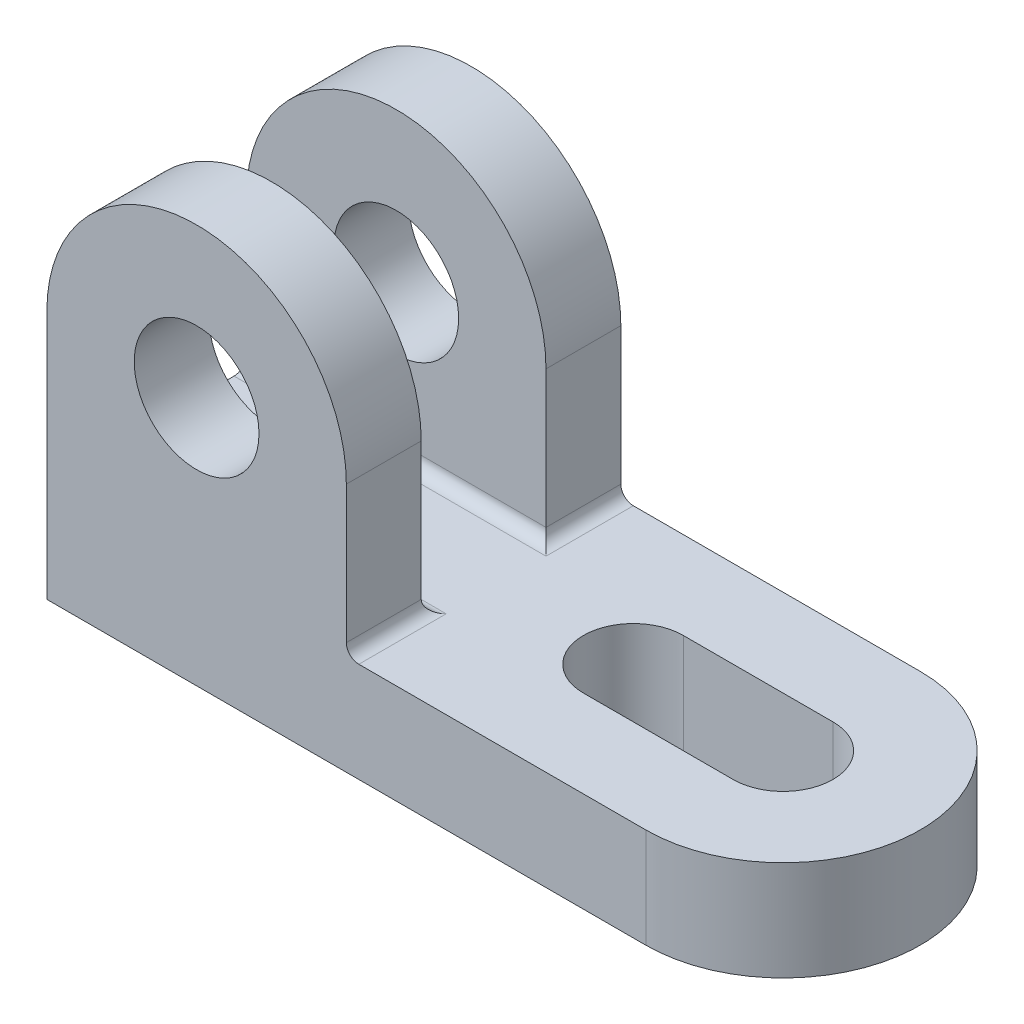
ISO-10303-21;
HEADER;
FILE_DESCRIPTION(('STEP AP214'),'2;1');
FILE_NAME('part.step','',(''),(''),'','','');
FILE_SCHEMA(('AUTOMOTIVE_DESIGN { 1 0 10303 214 1 1 1 1 }'));
ENDSEC;
DATA;
#1=APPLICATION_CONTEXT('core data for automotive mechanical design processes');
#2=APPLICATION_PROTOCOL_DEFINITION('international standard','automotive_design',2000,#1);
#3=PRODUCT_CONTEXT('',#1,'mechanical');
#4=PRODUCT('Part','Part','',(#3));
#5=PRODUCT_RELATED_PRODUCT_CATEGORY('part','',(#4));
#6=PRODUCT_DEFINITION_FORMATION('','',#4);
#7=PRODUCT_DEFINITION_CONTEXT('part definition',#1,'design');
#8=PRODUCT_DEFINITION('design','',#6,#7);
#9=PRODUCT_DEFINITION_SHAPE('','',#8);
#10=(LENGTH_UNIT() NAMED_UNIT(*) SI_UNIT(.MILLI.,.METRE.));
#11=(NAMED_UNIT(*) PLANE_ANGLE_UNIT() SI_UNIT($,.RADIAN.));
#12=(NAMED_UNIT(*) SI_UNIT($,.STERADIAN.) SOLID_ANGLE_UNIT());
#13=UNCERTAINTY_MEASURE_WITH_UNIT(LENGTH_MEASURE(1.E-05),#10,'distance_accuracy_value','');
#14=(GEOMETRIC_REPRESENTATION_CONTEXT(3) GLOBAL_UNCERTAINTY_ASSIGNED_CONTEXT((#13)) GLOBAL_UNIT_ASSIGNED_CONTEXT((#10,
#11,#12)) REPRESENTATION_CONTEXT('',''));
#15=CARTESIAN_POINT('',(0.,0.,0.));
#16=DIRECTION('',(0.,0.,1.));
#17=DIRECTION('',(1.,0.,0.));
#18=AXIS2_PLACEMENT_3D('',#15,#16,#17);
#19=CARTESIAN_POINT('',(0.,16.,22.));
#20=DIRECTION('',(0.,0.,-1.));
#21=DIRECTION('',(-1.,0.,0.));
#22=AXIS2_PLACEMENT_3D('',#19,#20,#21);
#23=PLANE('',#22);
#24=DIRECTION('',(1.,0.,0.));
#25=VECTOR('',#24,1.);
#26=CARTESIAN_POINT('',(0.,0.,22.));
#27=LINE('',#26,#25);
#28=CARTESIAN_POINT('',(-59.,0.,22.));
#29=VERTEX_POINT('',#28);
#30=CARTESIAN_POINT('',(37.,0.,22.));
#31=VERTEX_POINT('',#30);
#32=EDGE_CURVE('E227',#29,#31,#27,.T.);
#33=ORIENTED_EDGE('',*,*,#32,.T.);
#34=DIRECTION('',(0.,-1.,0.));
#35=VECTOR('',#34,1.);
#36=CARTESIAN_POINT('',(37.,16.,22.));
#37=LINE('',#36,#35);
#38=CARTESIAN_POINT('',(37.,16.,22.));
#39=VERTEX_POINT('',#38);
#40=EDGE_CURVE('E262',#39,#31,#37,.T.);
#41=ORIENTED_EDGE('',*,*,#40,.F.);
#42=DIRECTION('',(1.,0.,0.));
#43=VECTOR('',#42,1.);
#44=CARTESIAN_POINT('',(0.,16.,22.));
#45=LINE('',#44,#43);
#46=CARTESIAN_POINT('',(-9.,16.,22.));
#47=VERTEX_POINT('',#46);
#48=EDGE_CURVE('E240',#47,#39,#45,.T.);
#49=ORIENTED_EDGE('',*,*,#48,.F.);
#50=CARTESIAN_POINT('',(-9.,18.,22.));
#51=DIRECTION('',(0.,0.,-1.));
#52=DIRECTION('',(-1.,0.,0.));
#53=AXIS2_PLACEMENT_3D('',#50,#51,#52);
#54=CIRCLE('',#53,2.);
#55=CARTESIAN_POINT('',(-11.,18.,22.));
#56=VERTEX_POINT('',#55);
#57=EDGE_CURVE('E289',#47,#56,#54,.T.);
#58=ORIENTED_EDGE('',*,*,#57,.T.);
#59=DIRECTION('',(0.,1.,0.));
#60=VECTOR('',#59,1.);
#61=CARTESIAN_POINT('',(-11.,0.,22.));
#62=LINE('',#61,#60);
#63=CARTESIAN_POINT('',(-11.,40.,22.));
#64=VERTEX_POINT('',#63);
#65=EDGE_CURVE('E192',#56,#64,#62,.T.);
#66=ORIENTED_EDGE('',*,*,#65,.T.);
#67=CARTESIAN_POINT('',(-35.,40.,22.));
#68=DIRECTION('',(0.,0.,1.));
#69=DIRECTION('',(1.,0.,0.));
#70=AXIS2_PLACEMENT_3D('',#67,#68,#69);
#71=CIRCLE('',#70,24.);
#72=CARTESIAN_POINT('',(-59.,40.,22.));
#73=VERTEX_POINT('',#72);
#74=EDGE_CURVE('E183',#64,#73,#71,.T.);
#75=ORIENTED_EDGE('',*,*,#74,.T.);
#76=DIRECTION('',(0.,-1.,0.));
#77=VECTOR('',#76,1.);
#78=CARTESIAN_POINT('',(-59.,16.,22.));
#79=LINE('',#78,#77);
#80=EDGE_CURVE('E250',#73,#29,#79,.T.);
#81=ORIENTED_EDGE('',*,*,#80,.T.);
#82=EDGE_LOOP('',(#33,#41,#49,#58,#66,#75,#81));
#83=FACE_BOUND('',#82,.T.);
#84=CARTESIAN_POINT('',(-35.,40.,22.));
#85=DIRECTION('',(0.,0.,1.));
#86=DIRECTION('',(1.,0.,0.));
#87=AXIS2_PLACEMENT_3D('',#84,#85,#86);
#88=CIRCLE('',#87,10.);
#89=CARTESIAN_POINT('',(-25.,40.,22.));
#90=VERTEX_POINT('',#89);
#91=EDGE_CURVE('E176',#90,#90,#88,.T.);
#92=ORIENTED_EDGE('',*,*,#91,.F.);
#93=EDGE_LOOP('',(#92));
#94=FACE_BOUND('',#93,.T.);
#95=ADVANCED_FACE('F39',(#83,#94),#23,.F.);
#96=CARTESIAN_POINT('',(37.,16.,0.));
#97=DIRECTION('',(0.,-1.,0.));
#98=DIRECTION('',(0.,0.,-1.));
#99=AXIS2_PLACEMENT_3D('',#96,#97,#98);
#100=CYLINDRICAL_SURFACE('',#99,22.);
#101=CARTESIAN_POINT('',(37.,0.,0.));
#102=DIRECTION('',(0.,1.,0.));
#103=DIRECTION('',(0.,0.,1.));
#104=AXIS2_PLACEMENT_3D('',#101,#102,#103);
#105=CIRCLE('',#104,22.);
#106=CARTESIAN_POINT('',(37.,0.,-22.));
#107=VERTEX_POINT('',#106);
#108=EDGE_CURVE('E253',#31,#107,#105,.T.);
#109=ORIENTED_EDGE('',*,*,#108,.T.);
#110=DIRECTION('',(0.,-1.,0.));
#111=VECTOR('',#110,1.);
#112=CARTESIAN_POINT('',(37.,16.,-22.));
#113=LINE('',#112,#111);
#114=CARTESIAN_POINT('',(37.,16.,-22.));
#115=VERTEX_POINT('',#114);
#116=EDGE_CURVE('E265',#115,#107,#113,.T.);
#117=ORIENTED_EDGE('',*,*,#116,.F.);
#118=CARTESIAN_POINT('',(37.,16.,0.));
#119=DIRECTION('',(0.,1.,0.));
#120=DIRECTION('',(0.,0.,1.));
#121=AXIS2_PLACEMENT_3D('',#118,#119,#120);
#122=CIRCLE('',#121,22.);
#123=EDGE_CURVE('E239',#39,#115,#122,.T.);
#124=ORIENTED_EDGE('',*,*,#123,.F.);
#125=ORIENTED_EDGE('',*,*,#40,.T.);
#126=EDGE_LOOP('',(#109,#117,#124,#125));
#127=FACE_BOUND('',#126,.T.);
#128=ADVANCED_FACE('F335',(#127),#100,.T.);
#129=CARTESIAN_POINT('',(0.,16.,-22.));
#130=DIRECTION('',(0.,0.,-1.));
#131=DIRECTION('',(-1.,0.,0.));
#132=AXIS2_PLACEMENT_3D('',#129,#130,#131);
#133=PLANE('',#132);
#134=DIRECTION('',(1.,0.,0.));
#135=VECTOR('',#134,1.);
#136=CARTESIAN_POINT('',(0.,0.,-22.));
#137=LINE('',#136,#135);
#138=CARTESIAN_POINT('',(-59.,0.,-22.));
#139=VERTEX_POINT('',#138);
#140=EDGE_CURVE('E255',#139,#107,#137,.T.);
#141=ORIENTED_EDGE('',*,*,#140,.F.);
#142=DIRECTION('',(0.,-1.,0.));
#143=VECTOR('',#142,1.);
#144=CARTESIAN_POINT('',(-59.,16.,-22.));
#145=LINE('',#144,#143);
#146=CARTESIAN_POINT('',(-59.,40.,-22.));
#147=VERTEX_POINT('',#146);
#148=EDGE_CURVE('E257',#147,#139,#145,.T.);
#149=ORIENTED_EDGE('',*,*,#148,.F.);
#150=CARTESIAN_POINT('',(-35.,40.,-22.));
#151=DIRECTION('',(0.,0.,1.));
#152=DIRECTION('',(1.,0.,0.));
#153=AXIS2_PLACEMENT_3D('',#150,#151,#152);
#154=CIRCLE('',#153,24.);
#155=CARTESIAN_POINT('',(-11.,40.,-22.));
#156=VERTEX_POINT('',#155);
#157=EDGE_CURVE('E173',#156,#147,#154,.T.);
#158=ORIENTED_EDGE('',*,*,#157,.F.);
#159=DIRECTION('',(0.,1.,0.));
#160=VECTOR('',#159,1.);
#161=CARTESIAN_POINT('',(-11.,0.,-22.));
#162=LINE('',#161,#160);
#163=CARTESIAN_POINT('',(-11.,18.,-22.));
#164=VERTEX_POINT('',#163);
#165=EDGE_CURVE('E299',#164,#156,#162,.T.);
#166=ORIENTED_EDGE('',*,*,#165,.F.);
#167=CARTESIAN_POINT('',(-9.,18.,-22.));
#168=DIRECTION('',(0.,0.,-1.));
#169=DIRECTION('',(-1.,0.,0.));
#170=AXIS2_PLACEMENT_3D('',#167,#168,#169);
#171=CIRCLE('',#170,2.);
#172=CARTESIAN_POINT('',(-9.,16.,-22.));
#173=VERTEX_POINT('',#172);
#174=EDGE_CURVE('E48',#164,#173,#171,.F.);
#175=ORIENTED_EDGE('',*,*,#174,.T.);
#176=DIRECTION('',(1.,0.,0.));
#177=VECTOR('',#176,1.);
#178=CARTESIAN_POINT('',(0.,16.,-22.));
#179=LINE('',#178,#177);
#180=EDGE_CURVE('E245',#173,#115,#179,.T.);
#181=ORIENTED_EDGE('',*,*,#180,.T.);
#182=ORIENTED_EDGE('',*,*,#116,.T.);
#183=EDGE_LOOP('',(#141,#149,#158,#166,#175,#181,#182));
#184=FACE_BOUND('',#183,.T.);
#185=CARTESIAN_POINT('',(-35.,40.,-22.));
#186=DIRECTION('',(0.,0.,1.));
#187=DIRECTION('',(1.,0.,0.));
#188=AXIS2_PLACEMENT_3D('',#185,#186,#187);
#189=CIRCLE('',#188,10.);
#190=CARTESIAN_POINT('',(-25.,40.,-22.));
#191=VERTEX_POINT('',#190);
#192=EDGE_CURVE('E287',#191,#191,#189,.T.);
#193=ORIENTED_EDGE('',*,*,#192,.T.);
#194=EDGE_LOOP('',(#193));
#195=FACE_BOUND('',#194,.T.);
#196=ADVANCED_FACE('F339',(#184,#195),#133,.T.);
#197=CARTESIAN_POINT('',(-59.,16.,0.));
#198=DIRECTION('',(1.,0.,0.));
#199=DIRECTION('',(0.,0.,-1.));
#200=AXIS2_PLACEMENT_3D('',#197,#198,#199);
#201=PLANE('',#200);
#202=DIRECTION('',(0.,0.,1.));
#203=VECTOR('',#202,1.);
#204=CARTESIAN_POINT('',(-59.,0.,0.));
#205=LINE('',#204,#203);
#206=EDGE_CURVE('E238',#139,#29,#205,.T.);
#207=ORIENTED_EDGE('',*,*,#206,.T.);
#208=ORIENTED_EDGE('',*,*,#80,.F.);
#209=DIRECTION('',(0.,0.,1.));
#210=VECTOR('',#209,1.);
#211=CARTESIAN_POINT('',(-59.,40.,10.));
#212=LINE('',#211,#210);
#213=CARTESIAN_POINT('',(-59.,40.,10.));
#214=VERTEX_POINT('',#213);
#215=EDGE_CURVE('E200',#214,#73,#212,.T.);
#216=ORIENTED_EDGE('',*,*,#215,.F.);
#217=DIRECTION('',(0.,1.,0.));
#218=VECTOR('',#217,1.);
#219=CARTESIAN_POINT('',(-59.,0.,10.));
#220=LINE('',#219,#218);
#221=CARTESIAN_POINT('',(-59.,18.,10.));
#222=VERTEX_POINT('',#221);
#223=EDGE_CURVE('E187',#222,#214,#220,.T.);
#224=ORIENTED_EDGE('',*,*,#223,.F.);
#225=CARTESIAN_POINT('',(-59.,18.,8.00000000000001));
#226=DIRECTION('',(1.,0.,0.));
#227=DIRECTION('',(0.,0.,-1.));
#228=AXIS2_PLACEMENT_3D('',#225,#226,#227);
#229=CIRCLE('',#228,2.);
#230=CARTESIAN_POINT('',(-59.,16.,8.00000000000001));
#231=VERTEX_POINT('',#230);
#232=EDGE_CURVE('E283',#222,#231,#229,.T.);
#233=ORIENTED_EDGE('',*,*,#232,.T.);
#234=DIRECTION('',(0.,0.,1.));
#235=VECTOR('',#234,1.);
#236=CARTESIAN_POINT('',(-59.,16.,0.));
#237=LINE('',#236,#235);
#238=CARTESIAN_POINT('',(-59.,16.,-8.00000000000001));
#239=VERTEX_POINT('',#238);
#240=EDGE_CURVE('E242',#239,#231,#237,.T.);
#241=ORIENTED_EDGE('',*,*,#240,.F.);
#242=CARTESIAN_POINT('',(-59.,18.,-8.00000000000001));
#243=DIRECTION('',(1.,0.,0.));
#244=DIRECTION('',(0.,0.,-1.));
#245=AXIS2_PLACEMENT_3D('',#242,#243,#244);
#246=CIRCLE('',#245,2.);
#247=CARTESIAN_POINT('',(-59.,18.,-10.));
#248=VERTEX_POINT('',#247);
#249=EDGE_CURVE('E11',#239,#248,#246,.T.);
#250=ORIENTED_EDGE('',*,*,#249,.T.);
#251=DIRECTION('',(0.,1.,0.));
#252=VECTOR('',#251,1.);
#253=CARTESIAN_POINT('',(-59.,0.,-10.));
#254=LINE('',#253,#252);
#255=CARTESIAN_POINT('',(-59.,40.,-10.));
#256=VERTEX_POINT('',#255);
#257=EDGE_CURVE('E160',#248,#256,#254,.T.);
#258=ORIENTED_EDGE('',*,*,#257,.T.);
#259=DIRECTION('',(0.,0.,-1.));
#260=VECTOR('',#259,1.);
#261=CARTESIAN_POINT('',(-59.,40.,-10.));
#262=LINE('',#261,#260);
#263=EDGE_CURVE('E161',#256,#147,#262,.T.);
#264=ORIENTED_EDGE('',*,*,#263,.T.);
#265=ORIENTED_EDGE('',*,*,#148,.T.);
#266=EDGE_LOOP('',(#207,#208,#216,#224,#233,#241,#250,#258,#264,#265));
#267=FACE_BOUND('',#266,.T.);
#268=ADVANCED_FACE('F157',(#267),#201,.F.);
#269=CARTESIAN_POINT('',(0.,16.,0.));
#270=DIRECTION('',(0.,1.,0.));
#271=DIRECTION('',(0.,0.,1.));
#272=AXIS2_PLACEMENT_3D('',#269,#270,#271);
#273=PLANE('',#272);
#274=ORIENTED_EDGE('',*,*,#240,.T.);
#275=DIRECTION('',(-1.,0.,0.));
#276=VECTOR('',#275,1.);
#277=CARTESIAN_POINT('',(0.,16.,8.00000000000001));
#278=LINE('',#277,#276);
#279=CARTESIAN_POINT('',(-9.,16.,8.00000000000001));
#280=VERTEX_POINT('',#279);
#281=EDGE_CURVE('E277',#231,#280,#278,.F.);
#282=ORIENTED_EDGE('',*,*,#281,.T.);
#283=DIRECTION('',(0.,0.,1.));
#284=VECTOR('',#283,1.);
#285=CARTESIAN_POINT('',(-9.,16.,22.));
#286=LINE('',#285,#284);
#287=EDGE_CURVE('E273',#280,#47,#286,.T.);
#288=ORIENTED_EDGE('',*,*,#287,.T.);
#289=ORIENTED_EDGE('',*,*,#48,.T.);
#290=ORIENTED_EDGE('',*,*,#123,.T.);
#291=ORIENTED_EDGE('',*,*,#180,.F.);
#292=DIRECTION('',(0.,0.,-1.));
#293=VECTOR('',#292,1.);
#294=CARTESIAN_POINT('',(-9.,16.,0.));
#295=LINE('',#294,#293);
#296=CARTESIAN_POINT('',(-9.,16.,-8.00000000000001));
#297=VERTEX_POINT('',#296);
#298=EDGE_CURVE('E275',#173,#297,#295,.F.);
#299=ORIENTED_EDGE('',*,*,#298,.T.);
#300=DIRECTION('',(-1.,0.,0.));
#301=VECTOR('',#300,1.);
#302=CARTESIAN_POINT('',(0.,16.,-8.00000000000001));
#303=LINE('',#302,#301);
#304=EDGE_CURVE('E269',#297,#239,#303,.T.);
#305=ORIENTED_EDGE('',*,*,#304,.T.);
#306=EDGE_LOOP('',(#274,#282,#288,#289,#290,#291,#299,#305));
#307=FACE_BOUND('',#306,.T.);
#308=CARTESIAN_POINT('',(37.,16.,0.));
#309=DIRECTION('',(0.,1.,0.));
#310=DIRECTION('',(0.,0.,1.));
#311=AXIS2_PLACEMENT_3D('',#308,#309,#310);
#312=CIRCLE('',#311,8.00000000000001);
#313=CARTESIAN_POINT('',(37.,16.,8.00000000000001));
#314=VERTEX_POINT('',#313);
#315=CARTESIAN_POINT('',(37.,16.,-8.00000000000001));
#316=VERTEX_POINT('',#315);
#317=EDGE_CURVE('E205',#314,#316,#312,.T.);
#318=ORIENTED_EDGE('',*,*,#317,.F.);
#319=DIRECTION('',(1.,0.,0.));
#320=VECTOR('',#319,1.);
#321=CARTESIAN_POINT('',(37.,16.,8.00000000000001));
#322=LINE('',#321,#320);
#323=CARTESIAN_POINT('',(13.,16.,8.00000000000001));
#324=VERTEX_POINT('',#323);
#325=EDGE_CURVE('E207',#324,#314,#322,.T.);
#326=ORIENTED_EDGE('',*,*,#325,.F.);
#327=CARTESIAN_POINT('',(13.,16.,0.));
#328=DIRECTION('',(0.,1.,0.));
#329=DIRECTION('',(0.,0.,1.));
#330=AXIS2_PLACEMENT_3D('',#327,#328,#329);
#331=CIRCLE('',#330,8.00000000000001);
#332=CARTESIAN_POINT('',(13.,16.,-8.));
#333=VERTEX_POINT('',#332);
#334=EDGE_CURVE('E224',#333,#324,#331,.T.);
#335=ORIENTED_EDGE('',*,*,#334,.F.);
#336=DIRECTION('',(-1.,0.,0.));
#337=VECTOR('',#336,1.);
#338=CARTESIAN_POINT('',(37.,16.,-8.00000000000001));
#339=LINE('',#338,#337);
#340=EDGE_CURVE('E219',#316,#333,#339,.T.);
#341=ORIENTED_EDGE('',*,*,#340,.F.);
#342=EDGE_LOOP('',(#318,#326,#335,#341));
#343=FACE_BOUND('',#342,.T.);
#344=ADVANCED_FACE('F307',(#307,#343),#273,.T.);
#345=CARTESIAN_POINT('',(0.,0.,0.));
#346=DIRECTION('',(0.,1.,0.));
#347=DIRECTION('',(0.,0.,1.));
#348=AXIS2_PLACEMENT_3D('',#345,#346,#347);
#349=PLANE('',#348);
#350=DIRECTION('',(1.,0.,0.));
#351=VECTOR('',#350,1.);
#352=CARTESIAN_POINT('',(37.,0.,8.00000000000001));
#353=LINE('',#352,#351);
#354=CARTESIAN_POINT('',(13.,0.,8.00000000000001));
#355=VERTEX_POINT('',#354);
#356=CARTESIAN_POINT('',(37.,0.,8.00000000000001));
#357=VERTEX_POINT('',#356);
#358=EDGE_CURVE('E214',#355,#357,#353,.T.);
#359=ORIENTED_EDGE('',*,*,#358,.T.);
#360=CARTESIAN_POINT('',(37.,0.,0.));
#361=DIRECTION('',(0.,1.,0.));
#362=DIRECTION('',(0.,0.,1.));
#363=AXIS2_PLACEMENT_3D('',#360,#361,#362);
#364=CIRCLE('',#363,8.00000000000001);
#365=CARTESIAN_POINT('',(37.,0.,-8.00000000000001));
#366=VERTEX_POINT('',#365);
#367=EDGE_CURVE('E202',#357,#366,#364,.T.);
#368=ORIENTED_EDGE('',*,*,#367,.T.);
#369=DIRECTION('',(-1.,0.,0.));
#370=VECTOR('',#369,1.);
#371=CARTESIAN_POINT('',(37.,0.,-8.00000000000001));
#372=LINE('',#371,#370);
#373=CARTESIAN_POINT('',(13.,0.,-8.));
#374=VERTEX_POINT('',#373);
#375=EDGE_CURVE('E208',#366,#374,#372,.T.);
#376=ORIENTED_EDGE('',*,*,#375,.T.);
#377=CARTESIAN_POINT('',(13.,0.,0.));
#378=DIRECTION('',(0.,1.,0.));
#379=DIRECTION('',(0.,0.,1.));
#380=AXIS2_PLACEMENT_3D('',#377,#378,#379);
#381=CIRCLE('',#380,8.00000000000001);
#382=EDGE_CURVE('E215',#374,#355,#381,.T.);
#383=ORIENTED_EDGE('',*,*,#382,.T.);
#384=EDGE_LOOP('',(#359,#368,#376,#383));
#385=FACE_BOUND('',#384,.T.);
#386=ORIENTED_EDGE('',*,*,#32,.F.);
#387=ORIENTED_EDGE('',*,*,#206,.F.);
#388=ORIENTED_EDGE('',*,*,#140,.T.);
#389=ORIENTED_EDGE('',*,*,#108,.F.);
#390=EDGE_LOOP('',(#386,#387,#388,#389));
#391=FACE_BOUND('',#390,.T.);
#392=ADVANCED_FACE('F477',(#385,#391),#349,.F.);
#393=CARTESIAN_POINT('',(37.,0.,0.));
#394=DIRECTION('',(0.,1.,0.));
#395=DIRECTION('',(0.,0.,1.));
#396=AXIS2_PLACEMENT_3D('',#393,#394,#395);
#397=CYLINDRICAL_SURFACE('',#396,8.00000000000001);
#398=ORIENTED_EDGE('',*,*,#317,.T.);
#399=DIRECTION('',(0.,1.,0.));
#400=VECTOR('',#399,1.);
#401=CARTESIAN_POINT('',(37.,0.,-8.00000000000001));
#402=LINE('',#401,#400);
#403=EDGE_CURVE('E217',#366,#316,#402,.T.);
#404=ORIENTED_EDGE('',*,*,#403,.F.);
#405=ORIENTED_EDGE('',*,*,#367,.F.);
#406=DIRECTION('',(0.,1.,0.));
#407=VECTOR('',#406,1.);
#408=CARTESIAN_POINT('',(37.,0.,8.00000000000001));
#409=LINE('',#408,#407);
#410=EDGE_CURVE('E230',#357,#314,#409,.T.);
#411=ORIENTED_EDGE('',*,*,#410,.T.);
#412=EDGE_LOOP('',(#398,#404,#405,#411));
#413=FACE_BOUND('',#412,.T.);
#414=ADVANCED_FACE('F493',(#413),#397,.F.);
#415=CARTESIAN_POINT('',(37.,0.,8.00000000000001));
#416=DIRECTION('',(0.,0.,1.));
#417=DIRECTION('',(1.,0.,0.));
#418=AXIS2_PLACEMENT_3D('',#415,#416,#417);
#419=PLANE('',#418);
#420=ORIENTED_EDGE('',*,*,#325,.T.);
#421=ORIENTED_EDGE('',*,*,#410,.F.);
#422=ORIENTED_EDGE('',*,*,#358,.F.);
#423=DIRECTION('',(0.,1.,0.));
#424=VECTOR('',#423,1.);
#425=CARTESIAN_POINT('',(13.,0.,8.00000000000001));
#426=LINE('',#425,#424);
#427=EDGE_CURVE('E234',#355,#324,#426,.T.);
#428=ORIENTED_EDGE('',*,*,#427,.T.);
#429=EDGE_LOOP('',(#420,#421,#422,#428));
#430=FACE_BOUND('',#429,.T.);
#431=ADVANCED_FACE('F506',(#430),#419,.F.);
#432=CARTESIAN_POINT('',(13.,0.,0.));
#433=DIRECTION('',(0.,1.,0.));
#434=DIRECTION('',(0.,0.,1.));
#435=AXIS2_PLACEMENT_3D('',#432,#433,#434);
#436=CYLINDRICAL_SURFACE('',#435,8.00000000000001);
#437=ORIENTED_EDGE('',*,*,#334,.T.);
#438=ORIENTED_EDGE('',*,*,#427,.F.);
#439=ORIENTED_EDGE('',*,*,#382,.F.);
#440=DIRECTION('',(0.,1.,0.));
#441=VECTOR('',#440,1.);
#442=CARTESIAN_POINT('',(13.,0.,-8.));
#443=LINE('',#442,#441);
#444=EDGE_CURVE('E235',#374,#333,#443,.T.);
#445=ORIENTED_EDGE('',*,*,#444,.T.);
#446=EDGE_LOOP('',(#437,#438,#439,#445));
#447=FACE_BOUND('',#446,.T.);
#448=ADVANCED_FACE('F516',(#447),#436,.F.);
#449=CARTESIAN_POINT('',(37.,0.,-8.00000000000001));
#450=DIRECTION('',(0.,0.,-1.));
#451=DIRECTION('',(-1.,0.,0.));
#452=AXIS2_PLACEMENT_3D('',#449,#450,#451);
#453=PLANE('',#452);
#454=ORIENTED_EDGE('',*,*,#340,.T.);
#455=ORIENTED_EDGE('',*,*,#444,.F.);
#456=ORIENTED_EDGE('',*,*,#375,.F.);
#457=ORIENTED_EDGE('',*,*,#403,.T.);
#458=EDGE_LOOP('',(#454,#455,#456,#457));
#459=FACE_BOUND('',#458,.T.);
#460=ADVANCED_FACE('F472',(#459),#453,.F.);
#461=CARTESIAN_POINT('',(-11.,0.,10.));
#462=DIRECTION('',(1.,0.,0.));
#463=DIRECTION('',(0.,1.,0.));
#464=AXIS2_PLACEMENT_3D('',#461,#462,#463);
#465=PLANE('',#464);
#466=ORIENTED_EDGE('',*,*,#65,.F.);
#467=DIRECTION('',(0.,0.,1.));
#468=VECTOR('',#467,1.);
#469=CARTESIAN_POINT('',(-11.,18.,10.));
#470=LINE('',#469,#468);
#471=CARTESIAN_POINT('',(-11.,18.,10.));
#472=VERTEX_POINT('',#471);
#473=EDGE_CURVE('E279',#56,#472,#470,.F.);
#474=ORIENTED_EDGE('',*,*,#473,.T.);
#475=DIRECTION('',(0.,1.,0.));
#476=VECTOR('',#475,1.);
#477=CARTESIAN_POINT('',(-11.,0.,10.));
#478=LINE('',#477,#476);
#479=CARTESIAN_POINT('',(-11.,40.,10.));
#480=VERTEX_POINT('',#479);
#481=EDGE_CURVE('E184',#472,#480,#478,.T.);
#482=ORIENTED_EDGE('',*,*,#481,.T.);
#483=DIRECTION('',(0.,0.,1.));
#484=VECTOR('',#483,1.);
#485=CARTESIAN_POINT('',(-11.,40.,10.));
#486=LINE('',#485,#484);
#487=EDGE_CURVE('E191',#480,#64,#486,.T.);
#488=ORIENTED_EDGE('',*,*,#487,.T.);
#489=EDGE_LOOP('',(#466,#474,#482,#488));
#490=FACE_BOUND('',#489,.T.);
#491=ADVANCED_FACE('F468',(#490),#465,.T.);
#492=CARTESIAN_POINT('',(-35.,40.,10.));
#493=DIRECTION('',(0.,0.,1.));
#494=DIRECTION('',(1.,0.,0.));
#495=AXIS2_PLACEMENT_3D('',#492,#493,#494);
#496=CYLINDRICAL_SURFACE('',#495,10.);
#497=CARTESIAN_POINT('',(-35.,40.,10.));
#498=DIRECTION('',(0.,0.,1.));
#499=DIRECTION('',(1.,0.,0.));
#500=AXIS2_PLACEMENT_3D('',#497,#498,#499);
#501=CIRCLE('',#500,10.);
#502=CARTESIAN_POINT('',(-25.,40.,10.));
#503=VERTEX_POINT('',#502);
#504=EDGE_CURVE('E182',#503,#503,#501,.T.);
#505=ORIENTED_EDGE('',*,*,#504,.F.);
#506=EDGE_LOOP('',(#505));
#507=FACE_BOUND('',#506,.T.);
#508=ORIENTED_EDGE('',*,*,#91,.T.);
#509=EDGE_LOOP('',(#508));
#510=FACE_BOUND('',#509,.T.);
#511=ADVANCED_FACE('F473',(#507,#510),#496,.F.);
#512=CARTESIAN_POINT('',(-35.,40.,10.));
#513=DIRECTION('',(0.,0.,1.));
#514=DIRECTION('',(1.,0.,0.));
#515=AXIS2_PLACEMENT_3D('',#512,#513,#514);
#516=CYLINDRICAL_SURFACE('',#515,24.);
#517=ORIENTED_EDGE('',*,*,#74,.F.);
#518=ORIENTED_EDGE('',*,*,#487,.F.);
#519=CARTESIAN_POINT('',(-35.,40.,10.));
#520=DIRECTION('',(0.,0.,1.));
#521=DIRECTION('',(1.,0.,0.));
#522=AXIS2_PLACEMENT_3D('',#519,#520,#521);
#523=CIRCLE('',#522,24.);
#524=EDGE_CURVE('E186',#480,#214,#523,.T.);
#525=ORIENTED_EDGE('',*,*,#524,.T.);
#526=ORIENTED_EDGE('',*,*,#215,.T.);
#527=EDGE_LOOP('',(#517,#518,#525,#526));
#528=FACE_BOUND('',#527,.T.);
#529=ADVANCED_FACE('F464',(#528),#516,.T.);
#530=CARTESIAN_POINT('',(0.,0.,10.));
#531=DIRECTION('',(0.,0.,1.));
#532=DIRECTION('',(1.,0.,0.));
#533=AXIS2_PLACEMENT_3D('',#530,#531,#532);
#534=PLANE('',#533);
#535=ORIENTED_EDGE('',*,*,#504,.T.);
#536=EDGE_LOOP('',(#535));
#537=FACE_BOUND('',#536,.T.);
#538=ORIENTED_EDGE('',*,*,#481,.F.);
#539=DIRECTION('',(-1.,0.,0.));
#540=VECTOR('',#539,1.);
#541=CARTESIAN_POINT('',(0.,18.,10.));
#542=LINE('',#541,#540);
#543=EDGE_CURVE('E270',#472,#222,#542,.T.);
#544=ORIENTED_EDGE('',*,*,#543,.T.);
#545=ORIENTED_EDGE('',*,*,#223,.T.);
#546=ORIENTED_EDGE('',*,*,#524,.F.);
#547=EDGE_LOOP('',(#538,#544,#545,#546));
#548=FACE_BOUND('',#547,.T.);
#549=ADVANCED_FACE('F312',(#537,#548),#534,.F.);
#550=CARTESIAN_POINT('',(-11.,0.,-10.));
#551=DIRECTION('',(-1.,0.,0.));
#552=DIRECTION('',(0.,-1.,0.));
#553=AXIS2_PLACEMENT_3D('',#550,#551,#552);
#554=PLANE('',#553);
#555=DIRECTION('',(0.,1.,0.));
#556=VECTOR('',#555,1.);
#557=CARTESIAN_POINT('',(-11.,0.,-10.));
#558=LINE('',#557,#556);
#559=CARTESIAN_POINT('',(-11.,18.,-10.));
#560=VERTEX_POINT('',#559);
#561=CARTESIAN_POINT('',(-11.,40.,-10.));
#562=VERTEX_POINT('',#561);
#563=EDGE_CURVE('E163',#560,#562,#558,.T.);
#564=ORIENTED_EDGE('',*,*,#563,.F.);
#565=DIRECTION('',(0.,0.,-1.));
#566=VECTOR('',#565,1.);
#567=CARTESIAN_POINT('',(-11.,18.,-10.));
#568=LINE('',#567,#566);
#569=EDGE_CURVE('E278',#560,#164,#568,.T.);
#570=ORIENTED_EDGE('',*,*,#569,.T.);
#571=ORIENTED_EDGE('',*,*,#165,.T.);
#572=DIRECTION('',(0.,0.,-1.));
#573=VECTOR('',#572,1.);
#574=CARTESIAN_POINT('',(-11.,40.,-10.));
#575=LINE('',#574,#573);
#576=EDGE_CURVE('E172',#562,#156,#575,.T.);
#577=ORIENTED_EDGE('',*,*,#576,.F.);
#578=EDGE_LOOP('',(#564,#570,#571,#577));
#579=FACE_BOUND('',#578,.T.);
#580=ADVANCED_FACE('F337',(#579),#554,.F.);
#581=CARTESIAN_POINT('',(-35.,40.,-10.));
#582=DIRECTION('',(0.,0.,-1.));
#583=DIRECTION('',(-1.,0.,0.));
#584=AXIS2_PLACEMENT_3D('',#581,#582,#583);
#585=CYLINDRICAL_SURFACE('',#584,24.);
#586=ORIENTED_EDGE('',*,*,#157,.T.);
#587=ORIENTED_EDGE('',*,*,#263,.F.);
#588=CARTESIAN_POINT('',(-35.,40.,-10.));
#589=DIRECTION('',(0.,0.,1.));
#590=DIRECTION('',(1.,0.,0.));
#591=AXIS2_PLACEMENT_3D('',#588,#589,#590);
#592=CIRCLE('',#591,24.);
#593=EDGE_CURVE('E162',#562,#256,#592,.T.);
#594=ORIENTED_EDGE('',*,*,#593,.F.);
#595=ORIENTED_EDGE('',*,*,#576,.T.);
#596=EDGE_LOOP('',(#586,#587,#594,#595));
#597=FACE_BOUND('',#596,.T.);
#598=ADVANCED_FACE('F171',(#597),#585,.T.);
#599=CARTESIAN_POINT('',(-35.,40.,-10.));
#600=DIRECTION('',(0.,0.,-1.));
#601=DIRECTION('',(-1.,0.,0.));
#602=AXIS2_PLACEMENT_3D('',#599,#600,#601);
#603=CYLINDRICAL_SURFACE('',#602,10.);
#604=CARTESIAN_POINT('',(-35.,40.,-10.));
#605=DIRECTION('',(0.,0.,1.));
#606=DIRECTION('',(1.,0.,0.));
#607=AXIS2_PLACEMENT_3D('',#604,#605,#606);
#608=CIRCLE('',#607,10.);
#609=CARTESIAN_POINT('',(-25.,40.,-10.));
#610=VERTEX_POINT('',#609);
#611=EDGE_CURVE('E344',#610,#610,#608,.T.);
#612=ORIENTED_EDGE('',*,*,#611,.T.);
#613=EDGE_LOOP('',(#612));
#614=FACE_BOUND('',#613,.T.);
#615=ORIENTED_EDGE('',*,*,#192,.F.);
#616=EDGE_LOOP('',(#615));
#617=FACE_BOUND('',#616,.T.);
#618=ADVANCED_FACE('F346',(#614,#617),#603,.F.);
#619=CARTESIAN_POINT('',(0.,0.,-10.));
#620=DIRECTION('',(0.,0.,-1.));
#621=DIRECTION('',(1.,0.,0.));
#622=AXIS2_PLACEMENT_3D('',#619,#620,#621);
#623=PLANE('',#622);
#624=ORIENTED_EDGE('',*,*,#611,.F.);
#625=EDGE_LOOP('',(#624));
#626=FACE_BOUND('',#625,.T.);
#627=ORIENTED_EDGE('',*,*,#257,.F.);
#628=DIRECTION('',(-1.,0.,0.));
#629=VECTOR('',#628,1.);
#630=CARTESIAN_POINT('',(0.,18.,-10.));
#631=LINE('',#630,#629);
#632=EDGE_CURVE('E64',#248,#560,#631,.F.);
#633=ORIENTED_EDGE('',*,*,#632,.T.);
#634=ORIENTED_EDGE('',*,*,#563,.T.);
#635=ORIENTED_EDGE('',*,*,#593,.T.);
#636=EDGE_LOOP('',(#627,#633,#634,#635));
#637=FACE_BOUND('',#636,.T.);
#638=ADVANCED_FACE('F170',(#626,#637),#623,.F.);
#639=CARTESIAN_POINT('',(-9.,18.,0.));
#640=DIRECTION('',(0.,0.,-1.));
#641=DIRECTION('',(-1.,0.,0.));
#642=AXIS2_PLACEMENT_3D('',#639,#640,#641);
#643=CYLINDRICAL_SURFACE('',#642,2.);
#644=ORIENTED_EDGE('',*,*,#57,.F.);
#645=ORIENTED_EDGE('',*,*,#287,.F.);
#646=CARTESIAN_POINT('',(-9.,18.,8.00000000000001));
#647=DIRECTION('',(-0.707106781186547,0.,-0.707106781186547));
#648=DIRECTION('',(0.707106781186547,0.,-0.707106781186547));
#649=AXIS2_PLACEMENT_3D('',#646,#647,#648);
#650=ELLIPSE('',#649,2.82842712474619,2.);
#651=EDGE_CURVE('E290',#472,#280,#650,.F.);
#652=ORIENTED_EDGE('',*,*,#651,.F.);
#653=ORIENTED_EDGE('',*,*,#473,.F.);
#654=EDGE_LOOP('',(#644,#645,#652,#653));
#655=FACE_BOUND('',#654,.T.);
#656=ADVANCED_FACE('F323',(#655),#643,.F.);
#657=CARTESIAN_POINT('',(0.,18.,8.00000000000001));
#658=DIRECTION('',(-1.,0.,0.));
#659=DIRECTION('',(0.,0.,1.));
#660=AXIS2_PLACEMENT_3D('',#657,#658,#659);
#661=CYLINDRICAL_SURFACE('',#660,2.);
#662=ORIENTED_EDGE('',*,*,#651,.T.);
#663=ORIENTED_EDGE('',*,*,#281,.F.);
#664=ORIENTED_EDGE('',*,*,#232,.F.);
#665=ORIENTED_EDGE('',*,*,#543,.F.);
#666=EDGE_LOOP('',(#662,#663,#664,#665));
#667=FACE_BOUND('',#666,.T.);
#668=ADVANCED_FACE('F315',(#667),#661,.F.);
#669=CARTESIAN_POINT('',(0.,18.,-8.00000000000001));
#670=DIRECTION('',(-1.,0.,0.));
#671=DIRECTION('',(0.,0.,1.));
#672=AXIS2_PLACEMENT_3D('',#669,#670,#671);
#673=CYLINDRICAL_SURFACE('',#672,2.);
#674=ORIENTED_EDGE('',*,*,#249,.F.);
#675=ORIENTED_EDGE('',*,*,#304,.F.);
#676=CARTESIAN_POINT('',(-9.,18.,-8.00000000000001));
#677=DIRECTION('',(-0.707106781186547,0.,0.707106781186547));
#678=DIRECTION('',(-0.707106781186547,0.,-0.707106781186547));
#679=AXIS2_PLACEMENT_3D('',#676,#677,#678);
#680=ELLIPSE('',#679,2.82842712474619,2.);
#681=EDGE_CURVE('E43',#560,#297,#680,.T.);
#682=ORIENTED_EDGE('',*,*,#681,.F.);
#683=ORIENTED_EDGE('',*,*,#632,.F.);
#684=EDGE_LOOP('',(#674,#675,#682,#683));
#685=FACE_BOUND('',#684,.T.);
#686=ADVANCED_FACE('F41',(#685),#673,.F.);
#687=CARTESIAN_POINT('',(-9.,18.,-10.));
#688=DIRECTION('',(0.,0.,-1.));
#689=DIRECTION('',(-1.,0.,0.));
#690=AXIS2_PLACEMENT_3D('',#687,#688,#689);
#691=CYLINDRICAL_SURFACE('',#690,2.);
#692=ORIENTED_EDGE('',*,*,#681,.T.);
#693=ORIENTED_EDGE('',*,*,#298,.F.);
#694=ORIENTED_EDGE('',*,*,#174,.F.);
#695=ORIENTED_EDGE('',*,*,#569,.F.);
#696=EDGE_LOOP('',(#692,#693,#694,#695));
#697=FACE_BOUND('',#696,.T.);
#698=ADVANCED_FACE('F305',(#697),#691,.F.);
#699=CLOSED_SHELL('',(#95,#128,#196,#268,#344,#392,#414,#431,#448,#460,#491,#511,#529,#549,#580,
#598,#618,#638,#656,#668,#686,#698));
#700=MANIFOLD_SOLID_BREP('B2',#699);
#701=ADVANCED_BREP_SHAPE_REPRESENTATION('',(#18,#700),#14);
#702=SHAPE_DEFINITION_REPRESENTATION(#9,#701);
ENDSEC;
END-ISO-10303-21;
